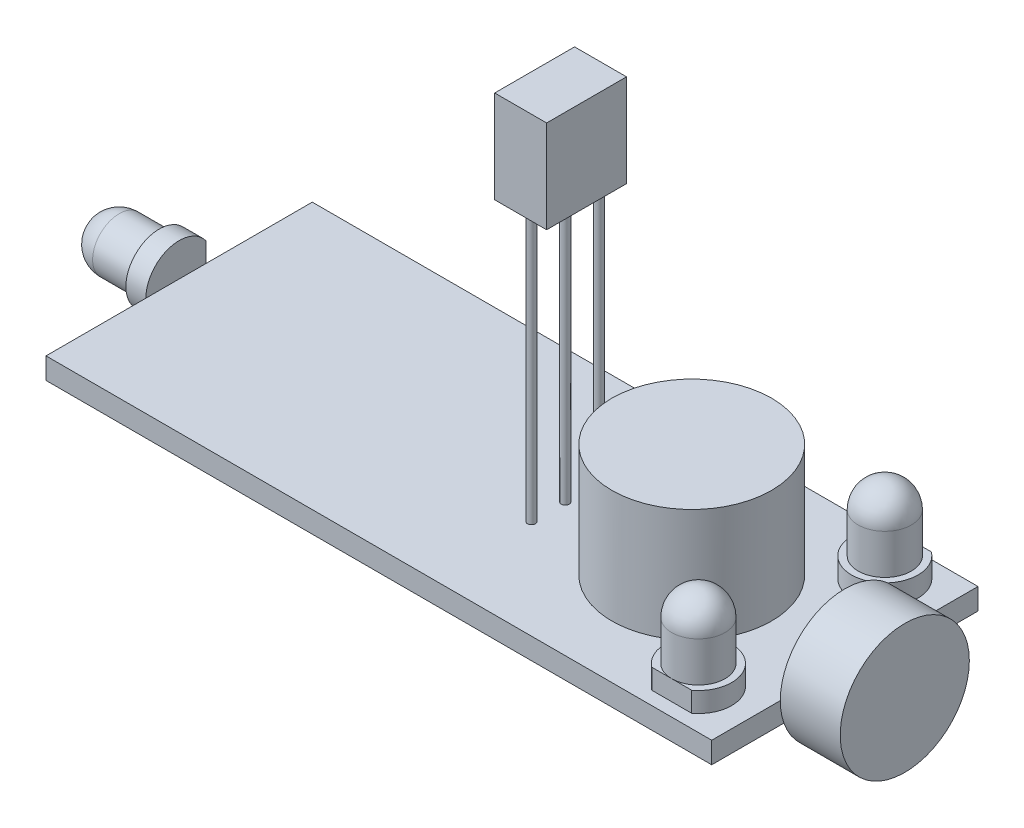
ISO-10303-21;
HEADER;
FILE_DESCRIPTION(('STEP AP214'),'2;1');
FILE_NAME('part.step','',(''),(''),'','','');
FILE_SCHEMA(('AUTOMOTIVE_DESIGN { 1 0 10303 214 1 1 1 1 }'));
ENDSEC;
DATA;
#1=APPLICATION_CONTEXT('core data for automotive mechanical design processes');
#2=APPLICATION_PROTOCOL_DEFINITION('international standard','automotive_design',2000,#1);
#3=PRODUCT_CONTEXT('',#1,'mechanical');
#4=PRODUCT('Part','Part','',(#3));
#5=PRODUCT_RELATED_PRODUCT_CATEGORY('part','',(#4));
#6=PRODUCT_DEFINITION_FORMATION('','',#4);
#7=PRODUCT_DEFINITION_CONTEXT('part definition',#1,'design');
#8=PRODUCT_DEFINITION('design','',#6,#7);
#9=PRODUCT_DEFINITION_SHAPE('','',#8);
#10=(LENGTH_UNIT() NAMED_UNIT(*) SI_UNIT(.MILLI.,.METRE.));
#11=(NAMED_UNIT(*) PLANE_ANGLE_UNIT() SI_UNIT($,.RADIAN.));
#12=(NAMED_UNIT(*) SI_UNIT($,.STERADIAN.) SOLID_ANGLE_UNIT());
#13=UNCERTAINTY_MEASURE_WITH_UNIT(LENGTH_MEASURE(1.E-05),#10,'distance_accuracy_value','');
#14=(GEOMETRIC_REPRESENTATION_CONTEXT(3) GLOBAL_UNCERTAINTY_ASSIGNED_CONTEXT((#13)) GLOBAL_UNIT_ASSIGNED_CONTEXT((#10,
#11,#12)) REPRESENTATION_CONTEXT('',''));
#15=CARTESIAN_POINT('',(0.,0.,0.));
#16=DIRECTION('',(0.,0.,1.));
#17=DIRECTION('',(1.,0.,0.));
#18=AXIS2_PLACEMENT_3D('',#15,#16,#17);
#19=CARTESIAN_POINT('',(0.,1.6,0.));
#20=DIRECTION('',(1.,0.,0.));
#21=DIRECTION('',(0.,0.,-1.));
#22=AXIS2_PLACEMENT_3D('',#19,#20,#21);
#23=PLANE('',#22);
#24=CARTESIAN_POINT('',(0.,1.6,-10.));
#25=DIRECTION('',(-1.,0.,0.));
#26=DIRECTION('',(0.,0.,1.));
#27=AXIS2_PLACEMENT_3D('',#24,#25,#26);
#28=CIRCLE('',#27,2.5);
#29=CARTESIAN_POINT('',(0.,0.,-8.07906272877015));
#30=VERTEX_POINT('',#29);
#31=CARTESIAN_POINT('',(0.,1.6,-7.5));
#32=VERTEX_POINT('',#31);
#33=EDGE_CURVE('E11',#30,#32,#28,.T.);
#34=ORIENTED_EDGE('',*,*,#33,.F.);
#35=DIRECTION('',(0.,0.,1.));
#36=VECTOR('',#35,1.);
#37=CARTESIAN_POINT('',(0.,0.,0.));
#38=LINE('',#37,#36);
#39=CARTESIAN_POINT('',(0.,0.,0.));
#40=VERTEX_POINT('',#39);
#41=EDGE_CURVE('E288',#30,#40,#38,.T.);
#42=ORIENTED_EDGE('',*,*,#41,.T.);
#43=DIRECTION('',(0.,-1.,0.));
#44=VECTOR('',#43,1.);
#45=CARTESIAN_POINT('',(0.,1.6,0.));
#46=LINE('',#45,#44);
#47=CARTESIAN_POINT('',(0.,1.6,0.));
#48=VERTEX_POINT('',#47);
#49=EDGE_CURVE('E323',#48,#40,#46,.T.);
#50=ORIENTED_EDGE('',*,*,#49,.F.);
#51=DIRECTION('',(0.,0.,1.));
#52=VECTOR('',#51,1.);
#53=CARTESIAN_POINT('',(0.,1.6,0.));
#54=LINE('',#53,#52);
#55=EDGE_CURVE('E55',#32,#48,#54,.T.);
#56=ORIENTED_EDGE('',*,*,#55,.F.);
#57=EDGE_LOOP('',(#34,#42,#50,#56));
#58=FACE_BOUND('',#57,.T.);
#59=ADVANCED_FACE('F37',(#58),#23,.F.);
#60=CARTESIAN_POINT('',(0.,0.100000000000001,-12.));
#61=VERTEX_POINT('',#60);
#62=CARTESIAN_POINT('',(0.,0.,-11.9209372712299));
#63=VERTEX_POINT('',#62);
#64=EDGE_CURVE('E47',#61,#63,#28,.T.);
#65=ORIENTED_EDGE('',*,*,#64,.F.);
#66=DIRECTION('',(0.,-1.,0.));
#67=VECTOR('',#66,1.);
#68=CARTESIAN_POINT('',(0.,0.,-12.));
#69=LINE('',#68,#67);
#70=CARTESIAN_POINT('',(0.,1.6,-12.));
#71=VERTEX_POINT('',#70);
#72=EDGE_CURVE('E45',#71,#61,#69,.T.);
#73=ORIENTED_EDGE('',*,*,#72,.F.);
#74=CARTESIAN_POINT('',(0.,1.6,-20.));
#75=VERTEX_POINT('',#74);
#76=EDGE_CURVE('E289',#75,#71,#54,.T.);
#77=ORIENTED_EDGE('',*,*,#76,.F.);
#78=DIRECTION('',(0.,-1.,0.));
#79=VECTOR('',#78,1.);
#80=CARTESIAN_POINT('',(0.,1.6,-20.));
#81=LINE('',#80,#79);
#82=CARTESIAN_POINT('',(0.,0.,-20.));
#83=VERTEX_POINT('',#82);
#84=EDGE_CURVE('E301',#75,#83,#81,.T.);
#85=ORIENTED_EDGE('',*,*,#84,.T.);
#86=EDGE_CURVE('E302',#83,#63,#38,.T.);
#87=ORIENTED_EDGE('',*,*,#86,.T.);
#88=EDGE_LOOP('',(#65,#73,#77,#85,#87));
#89=FACE_BOUND('',#88,.T.);
#90=ADVANCED_FACE('F413',(#89),#23,.F.);
#91=CARTESIAN_POINT('',(46.,3.1,-17.));
#92=DIRECTION('',(0.,-1.,0.));
#93=DIRECTION('',(0.,0.,-1.));
#94=AXIS2_PLACEMENT_3D('',#91,#92,#93);
#95=CYLINDRICAL_SURFACE('',#94,2.5);
#96=DIRECTION('',(0.,-1.,0.));
#97=VECTOR('',#96,1.);
#98=CARTESIAN_POINT('',(47.5,28.551,-19.));
#99=LINE('',#98,#97);
#100=CARTESIAN_POINT('',(47.5,3.1,-19.));
#101=VERTEX_POINT('',#100);
#102=CARTESIAN_POINT('',(47.5,1.6,-19.));
#103=VERTEX_POINT('',#102);
#104=EDGE_CURVE('E224',#101,#103,#99,.T.);
#105=ORIENTED_EDGE('',*,*,#104,.F.);
#106=CARTESIAN_POINT('',(46.,3.1,-17.));
#107=DIRECTION('',(0.,1.,0.));
#108=DIRECTION('',(0.,0.,1.));
#109=AXIS2_PLACEMENT_3D('',#106,#107,#108);
#110=CIRCLE('',#109,2.5);
#111=CARTESIAN_POINT('',(44.5,3.1,-19.));
#112=VERTEX_POINT('',#111);
#113=EDGE_CURVE('E235',#112,#101,#110,.T.);
#114=ORIENTED_EDGE('',*,*,#113,.F.);
#115=DIRECTION('',(0.,-1.,0.));
#116=VECTOR('',#115,1.);
#117=CARTESIAN_POINT('',(44.5,28.551,-19.));
#118=LINE('',#117,#116);
#119=CARTESIAN_POINT('',(44.5,1.6,-19.));
#120=VERTEX_POINT('',#119);
#121=EDGE_CURVE('E226',#112,#120,#118,.T.);
#122=ORIENTED_EDGE('',*,*,#121,.T.);
#123=CARTESIAN_POINT('',(46.,1.6,-17.));
#124=DIRECTION('',(0.,-1.,0.));
#125=DIRECTION('',(0.,0.,-1.));
#126=AXIS2_PLACEMENT_3D('',#123,#124,#125);
#127=CIRCLE('',#126,2.5);
#128=EDGE_CURVE('E341',#120,#103,#127,.F.);
#129=ORIENTED_EDGE('',*,*,#128,.T.);
#130=EDGE_LOOP('',(#105,#114,#122,#129));
#131=FACE_BOUND('',#130,.T.);
#132=ADVANCED_FACE('F417',(#131),#95,.T.);
#133=CARTESIAN_POINT('',(0.,3.1,0.));
#134=DIRECTION('',(0.,1.,0.));
#135=DIRECTION('',(0.,0.,1.));
#136=AXIS2_PLACEMENT_3D('',#133,#134,#135);
#137=PLANE('',#136);
#138=ORIENTED_EDGE('',*,*,#113,.T.);
#139=DIRECTION('',(1.,0.,0.));
#140=VECTOR('',#139,1.);
#141=CARTESIAN_POINT('',(44.5,3.1,-19.));
#142=LINE('',#141,#140);
#143=CARTESIAN_POINT('',(46.,3.1,-19.));
#144=VERTEX_POINT('',#143);
#145=EDGE_CURVE('E229',#144,#101,#142,.T.);
#146=ORIENTED_EDGE('',*,*,#145,.F.);
#147=CARTESIAN_POINT('',(46.,3.1,-17.));
#148=DIRECTION('',(0.,1.,0.));
#149=DIRECTION('',(0.,0.,1.));
#150=AXIS2_PLACEMENT_3D('',#147,#148,#149);
#151=CIRCLE('',#150,2.);
#152=EDGE_CURVE('E343',#144,#144,#151,.T.);
#153=ORIENTED_EDGE('',*,*,#152,.F.);
#154=EDGE_CURVE('E230',#112,#144,#142,.T.);
#155=ORIENTED_EDGE('',*,*,#154,.F.);
#156=EDGE_LOOP('',(#138,#146,#153,#155));
#157=FACE_BOUND('',#156,.T.);
#158=ADVANCED_FACE('F421',(#157),#137,.T.);
#159=CARTESIAN_POINT('',(0.,1.6,0.));
#160=DIRECTION('',(0.,-1.,0.));
#161=DIRECTION('',(0.,0.,-1.));
#162=AXIS2_PLACEMENT_3D('',#159,#160,#161);
#163=PLANE('',#162);
#164=CARTESIAN_POINT('',(46.,1.6,-3.));
#165=DIRECTION('',(0.,-1.,0.));
#166=DIRECTION('',(0.,0.,-1.));
#167=AXIS2_PLACEMENT_3D('',#164,#165,#166);
#168=CIRCLE('',#167,2.5);
#169=CARTESIAN_POINT('',(44.5,1.6,-0.999999999999997));
#170=VERTEX_POINT('',#169);
#171=CARTESIAN_POINT('',(47.5,1.6,-0.999999999999997));
#172=VERTEX_POINT('',#171);
#173=EDGE_CURVE('E215',#170,#172,#168,.T.);
#174=ORIENTED_EDGE('',*,*,#173,.T.);
#175=DIRECTION('',(1.,0.,0.));
#176=VECTOR('',#175,1.);
#177=CARTESIAN_POINT('',(44.5,1.6,-0.999999999999997));
#178=LINE('',#177,#176);
#179=EDGE_CURVE('E201',#170,#172,#178,.T.);
#180=ORIENTED_EDGE('',*,*,#179,.F.);
#181=EDGE_LOOP('',(#174,#180));
#182=FACE_BOUND('',#181,.T.);
#183=CARTESIAN_POINT('',(38.5,1.6,-10.));
#184=DIRECTION('',(0.,-1.,0.));
#185=DIRECTION('',(0.,0.,-1.));
#186=AXIS2_PLACEMENT_3D('',#183,#184,#185);
#187=CIRCLE('',#186,6.00000000000001);
#188=CARTESIAN_POINT('',(38.5,1.6,-16.));
#189=VERTEX_POINT('',#188);
#190=EDGE_CURVE('E338',#189,#189,#187,.F.);
#191=ORIENTED_EDGE('',*,*,#190,.F.);
#192=EDGE_LOOP('',(#191));
#193=FACE_BOUND('',#192,.T.);
#194=CARTESIAN_POINT('',(29.,1.6,-10.));
#195=DIRECTION('',(0.,-1.,0.));
#196=DIRECTION('',(0.,0.,-1.));
#197=AXIS2_PLACEMENT_3D('',#194,#195,#196);
#198=CIRCLE('',#197,0.300000000000004);
#199=CARTESIAN_POINT('',(29.,1.6,-10.3));
#200=VERTEX_POINT('',#199);
#201=EDGE_CURVE('E329',#200,#200,#198,.F.);
#202=ORIENTED_EDGE('',*,*,#201,.F.);
#203=EDGE_LOOP('',(#202));
#204=FACE_BOUND('',#203,.T.);
#205=ORIENTED_EDGE('',*,*,#76,.T.);
#206=EDGE_CURVE('E292',#71,#32,#54,.T.);
#207=ORIENTED_EDGE('',*,*,#206,.T.);
#208=ORIENTED_EDGE('',*,*,#55,.T.);
#209=DIRECTION('',(1.,0.,0.));
#210=VECTOR('',#209,1.);
#211=CARTESIAN_POINT('',(0.,1.6,0.));
#212=LINE('',#211,#210);
#213=CARTESIAN_POINT('',(50.,1.6,0.));
#214=VERTEX_POINT('',#213);
#215=EDGE_CURVE('E291',#48,#214,#212,.T.);
#216=ORIENTED_EDGE('',*,*,#215,.T.);
#217=DIRECTION('',(0.,0.,-1.));
#218=VECTOR('',#217,1.);
#219=CARTESIAN_POINT('',(50.,1.6,0.));
#220=LINE('',#219,#218);
#221=CARTESIAN_POINT('',(50.,1.6,-5.15));
#222=VERTEX_POINT('',#221);
#223=EDGE_CURVE('E295',#214,#222,#220,.T.);
#224=ORIENTED_EDGE('',*,*,#223,.T.);
#225=CARTESIAN_POINT('',(50.,1.6,-14.85));
#226=VERTEX_POINT('',#225);
#227=EDGE_CURVE('E299',#222,#226,#220,.T.);
#228=ORIENTED_EDGE('',*,*,#227,.T.);
#229=CARTESIAN_POINT('',(50.,1.6,-20.));
#230=VERTEX_POINT('',#229);
#231=EDGE_CURVE('E294',#226,#230,#220,.T.);
#232=ORIENTED_EDGE('',*,*,#231,.T.);
#233=DIRECTION('',(-1.,0.,0.));
#234=VECTOR('',#233,1.);
#235=CARTESIAN_POINT('',(0.,1.6,-20.));
#236=LINE('',#235,#234);
#237=EDGE_CURVE('E298',#230,#75,#236,.T.);
#238=ORIENTED_EDGE('',*,*,#237,.T.);
#239=EDGE_LOOP('',(#205,#207,#208,#216,#224,#228,#232,#238));
#240=FACE_BOUND('',#239,.T.);
#241=CARTESIAN_POINT('',(29.,1.6,-12.54));
#242=DIRECTION('',(0.,-1.,0.));
#243=DIRECTION('',(0.,0.,-1.));
#244=AXIS2_PLACEMENT_3D('',#241,#242,#243);
#245=CIRCLE('',#244,0.300000000000004);
#246=CARTESIAN_POINT('',(29.,1.6,-12.84));
#247=VERTEX_POINT('',#246);
#248=EDGE_CURVE('E326',#247,#247,#245,.F.);
#249=ORIENTED_EDGE('',*,*,#248,.F.);
#250=EDGE_LOOP('',(#249));
#251=FACE_BOUND('',#250,.T.);
#252=CARTESIAN_POINT('',(29.,1.6,-7.46));
#253=DIRECTION('',(0.,-1.,0.));
#254=DIRECTION('',(0.,0.,-1.));
#255=AXIS2_PLACEMENT_3D('',#252,#253,#254);
#256=CIRCLE('',#255,0.300000000000004);
#257=CARTESIAN_POINT('',(29.,1.6,-7.76));
#258=VERTEX_POINT('',#257);
#259=EDGE_CURVE('E332',#258,#258,#256,.F.);
#260=ORIENTED_EDGE('',*,*,#259,.F.);
#261=EDGE_LOOP('',(#260));
#262=FACE_BOUND('',#261,.T.);
#263=ORIENTED_EDGE('',*,*,#128,.F.);
#264=DIRECTION('',(1.,0.,0.));
#265=VECTOR('',#264,1.);
#266=CARTESIAN_POINT('',(44.5,1.6,-19.));
#267=LINE('',#266,#265);
#268=EDGE_CURVE('E219',#120,#103,#267,.T.);
#269=ORIENTED_EDGE('',*,*,#268,.T.);
#270=EDGE_LOOP('',(#263,#269));
#271=FACE_BOUND('',#270,.T.);
#272=ADVANCED_FACE('F362',(#182,#193,#204,#240,#251,#262,#271),#163,.F.);
#273=CARTESIAN_POINT('',(50.,1.6,0.));
#274=DIRECTION('',(-1.,0.,0.));
#275=DIRECTION('',(0.,0.,1.));
#276=AXIS2_PLACEMENT_3D('',#273,#274,#275);
#277=PLANE('',#276);
#278=CARTESIAN_POINT('',(50.,1.6,-10.));
#279=DIRECTION('',(1.,0.,0.));
#280=DIRECTION('',(0.,0.,-1.));
#281=AXIS2_PLACEMENT_3D('',#278,#279,#280);
#282=CIRCLE('',#281,4.85);
#283=CARTESIAN_POINT('',(50.,0.,-5.42151771871944));
#284=VERTEX_POINT('',#283);
#285=EDGE_CURVE('E344',#222,#284,#282,.T.);
#286=ORIENTED_EDGE('',*,*,#285,.F.);
#287=ORIENTED_EDGE('',*,*,#223,.F.);
#288=DIRECTION('',(0.,-1.,0.));
#289=VECTOR('',#288,1.);
#290=CARTESIAN_POINT('',(50.,1.6,0.));
#291=LINE('',#290,#289);
#292=CARTESIAN_POINT('',(50.,0.,0.));
#293=VERTEX_POINT('',#292);
#294=EDGE_CURVE('E320',#214,#293,#291,.T.);
#295=ORIENTED_EDGE('',*,*,#294,.T.);
#296=DIRECTION('',(0.,0.,-1.));
#297=VECTOR('',#296,1.);
#298=CARTESIAN_POINT('',(50.,0.,0.));
#299=LINE('',#298,#297);
#300=EDGE_CURVE('E309',#293,#284,#299,.T.);
#301=ORIENTED_EDGE('',*,*,#300,.T.);
#302=EDGE_LOOP('',(#286,#287,#295,#301));
#303=FACE_BOUND('',#302,.T.);
#304=ADVANCED_FACE('F376',(#303),#277,.F.);
#305=CARTESIAN_POINT('',(50.,0.,-14.5784822812806));
#306=VERTEX_POINT('',#305);
#307=EDGE_CURVE('E246',#306,#226,#282,.T.);
#308=ORIENTED_EDGE('',*,*,#307,.F.);
#309=CARTESIAN_POINT('',(50.,0.,-20.));
#310=VERTEX_POINT('',#309);
#311=EDGE_CURVE('E308',#306,#310,#299,.T.);
#312=ORIENTED_EDGE('',*,*,#311,.T.);
#313=DIRECTION('',(0.,-1.,0.));
#314=VECTOR('',#313,1.);
#315=CARTESIAN_POINT('',(50.,1.6,-20.));
#316=LINE('',#315,#314);
#317=EDGE_CURVE('E317',#230,#310,#316,.T.);
#318=ORIENTED_EDGE('',*,*,#317,.F.);
#319=ORIENTED_EDGE('',*,*,#231,.F.);
#320=EDGE_LOOP('',(#308,#312,#318,#319));
#321=FACE_BOUND('',#320,.T.);
#322=ADVANCED_FACE('F390',(#321),#277,.F.);
#323=CARTESIAN_POINT('',(26.7,28.55,-13.));
#324=DIRECTION('',(1.,0.,0.));
#325=DIRECTION('',(0.,0.,-1.));
#326=AXIS2_PLACEMENT_3D('',#323,#324,#325);
#327=PLANE('',#326);
#328=DIRECTION('',(0.,0.,1.));
#329=VECTOR('',#328,1.);
#330=CARTESIAN_POINT('',(26.7,21.6,-13.));
#331=LINE('',#330,#329);
#332=CARTESIAN_POINT('',(26.7,21.6,-13.));
#333=VERTEX_POINT('',#332);
#334=CARTESIAN_POINT('',(26.7,21.6,-7.));
#335=VERTEX_POINT('',#334);
#336=EDGE_CURVE('E249',#333,#335,#331,.T.);
#337=ORIENTED_EDGE('',*,*,#336,.T.);
#338=DIRECTION('',(0.,-1.,0.));
#339=VECTOR('',#338,1.);
#340=CARTESIAN_POINT('',(26.7,28.55,-7.));
#341=LINE('',#340,#339);
#342=CARTESIAN_POINT('',(26.7,28.55,-7.));
#343=VERTEX_POINT('',#342);
#344=EDGE_CURVE('E276',#343,#335,#341,.T.);
#345=ORIENTED_EDGE('',*,*,#344,.F.);
#346=DIRECTION('',(0.,0.,1.));
#347=VECTOR('',#346,1.);
#348=CARTESIAN_POINT('',(26.7,28.55,-13.));
#349=LINE('',#348,#347);
#350=CARTESIAN_POINT('',(26.7,28.55,-13.));
#351=VERTEX_POINT('',#350);
#352=EDGE_CURVE('E250',#351,#343,#349,.T.);
#353=ORIENTED_EDGE('',*,*,#352,.F.);
#354=DIRECTION('',(0.,-1.,0.));
#355=VECTOR('',#354,1.);
#356=CARTESIAN_POINT('',(26.7,28.55,-13.));
#357=LINE('',#356,#355);
#358=EDGE_CURVE('E260',#351,#333,#357,.T.);
#359=ORIENTED_EDGE('',*,*,#358,.T.);
#360=EDGE_LOOP('',(#337,#345,#353,#359));
#361=FACE_BOUND('',#360,.T.);
#362=CARTESIAN_POINT('',(26.7,25.85,-10.));
#363=DIRECTION('',(1.,0.,0.));
#364=DIRECTION('',(0.,0.,-1.));
#365=AXIS2_PLACEMENT_3D('',#362,#363,#364);
#366=CIRCLE('',#365,2.5);
#367=CARTESIAN_POINT('',(26.7,25.85,-12.5));
#368=VERTEX_POINT('',#367);
#369=EDGE_CURVE('E335',#368,#368,#366,.F.);
#370=ORIENTED_EDGE('',*,*,#369,.F.);
#371=EDGE_LOOP('',(#370));
#372=FACE_BOUND('',#371,.T.);
#373=ADVANCED_FACE('F667',(#361,#372),#327,.F.);
#374=CARTESIAN_POINT('',(0.,1.6,0.));
#375=DIRECTION('',(0.,0.,-1.));
#376=DIRECTION('',(-1.,0.,0.));
#377=AXIS2_PLACEMENT_3D('',#374,#375,#376);
#378=PLANE('',#377);
#379=DIRECTION('',(1.,0.,0.));
#380=VECTOR('',#379,1.);
#381=CARTESIAN_POINT('',(0.,0.,0.));
#382=LINE('',#381,#380);
#383=EDGE_CURVE('E305',#40,#293,#382,.T.);
#384=ORIENTED_EDGE('',*,*,#383,.T.);
#385=ORIENTED_EDGE('',*,*,#294,.F.);
#386=ORIENTED_EDGE('',*,*,#215,.F.);
#387=ORIENTED_EDGE('',*,*,#49,.T.);
#388=EDGE_LOOP('',(#384,#385,#386,#387));
#389=FACE_BOUND('',#388,.T.);
#390=ADVANCED_FACE('F366',(#389),#378,.F.);
#391=CARTESIAN_POINT('',(0.,1.6,-20.));
#392=DIRECTION('',(0.,0.,1.));
#393=DIRECTION('',(1.,0.,0.));
#394=AXIS2_PLACEMENT_3D('',#391,#392,#393);
#395=PLANE('',#394);
#396=DIRECTION('',(-1.,0.,0.));
#397=VECTOR('',#396,1.);
#398=CARTESIAN_POINT('',(0.,0.,-20.));
#399=LINE('',#398,#397);
#400=EDGE_CURVE('E312',#310,#83,#399,.T.);
#401=ORIENTED_EDGE('',*,*,#400,.T.);
#402=ORIENTED_EDGE('',*,*,#84,.F.);
#403=ORIENTED_EDGE('',*,*,#237,.F.);
#404=ORIENTED_EDGE('',*,*,#317,.T.);
#405=EDGE_LOOP('',(#401,#402,#403,#404));
#406=FACE_BOUND('',#405,.T.);
#407=ADVANCED_FACE('F505',(#406),#395,.F.);
#408=CARTESIAN_POINT('',(0.,0.,0.));
#409=DIRECTION('',(0.,-1.,0.));
#410=DIRECTION('',(0.,0.,-1.));
#411=AXIS2_PLACEMENT_3D('',#408,#409,#410);
#412=PLANE('',#411);
#413=ORIENTED_EDGE('',*,*,#86,.F.);
#414=ORIENTED_EDGE('',*,*,#400,.F.);
#415=ORIENTED_EDGE('',*,*,#311,.F.);
#416=EDGE_CURVE('E313',#284,#306,#299,.T.);
#417=ORIENTED_EDGE('',*,*,#416,.F.);
#418=ORIENTED_EDGE('',*,*,#300,.F.);
#419=ORIENTED_EDGE('',*,*,#383,.F.);
#420=ORIENTED_EDGE('',*,*,#41,.F.);
#421=EDGE_CURVE('E306',#63,#30,#38,.T.);
#422=ORIENTED_EDGE('',*,*,#421,.F.);
#423=EDGE_LOOP('',(#413,#414,#415,#417,#418,#419,#420,#422));
#424=FACE_BOUND('',#423,.T.);
#425=ADVANCED_FACE('F374',(#424),#412,.T.);
#426=CARTESIAN_POINT('',(29.,21.6,-12.54));
#427=DIRECTION('',(0.,-1.,0.));
#428=DIRECTION('',(0.,0.,-1.));
#429=AXIS2_PLACEMENT_3D('',#426,#427,#428);
#430=CYLINDRICAL_SURFACE('',#429,0.300000000000004);
#431=CARTESIAN_POINT('',(29.,21.6,-12.54));
#432=DIRECTION('',(0.,1.,0.));
#433=DIRECTION('',(0.,0.,1.));
#434=AXIS2_PLACEMENT_3D('',#431,#432,#433);
#435=CIRCLE('',#434,0.300000000000004);
#436=CARTESIAN_POINT('',(29.,21.6,-12.24));
#437=VERTEX_POINT('',#436);
#438=EDGE_CURVE('E285',#437,#437,#435,.T.);
#439=ORIENTED_EDGE('',*,*,#438,.F.);
#440=EDGE_LOOP('',(#439));
#441=FACE_BOUND('',#440,.T.);
#442=ORIENTED_EDGE('',*,*,#248,.T.);
#443=EDGE_LOOP('',(#442));
#444=FACE_BOUND('',#443,.T.);
#445=ADVANCED_FACE('F504',(#441,#444),#430,.T.);
#446=CARTESIAN_POINT('',(29.,21.6,-10.));
#447=DIRECTION('',(0.,-1.,0.));
#448=DIRECTION('',(0.,0.,-1.));
#449=AXIS2_PLACEMENT_3D('',#446,#447,#448);
#450=CYLINDRICAL_SURFACE('',#449,0.300000000000004);
#451=CARTESIAN_POINT('',(29.,21.6,-10.));
#452=DIRECTION('',(0.,1.,0.));
#453=DIRECTION('',(0.,0.,1.));
#454=AXIS2_PLACEMENT_3D('',#451,#452,#453);
#455=CIRCLE('',#454,0.300000000000004);
#456=CARTESIAN_POINT('',(29.,21.6,-9.7));
#457=VERTEX_POINT('',#456);
#458=EDGE_CURVE('E282',#457,#457,#455,.T.);
#459=ORIENTED_EDGE('',*,*,#458,.F.);
#460=EDGE_LOOP('',(#459));
#461=FACE_BOUND('',#460,.T.);
#462=ORIENTED_EDGE('',*,*,#201,.T.);
#463=EDGE_LOOP('',(#462));
#464=FACE_BOUND('',#463,.T.);
#465=ADVANCED_FACE('F768',(#461,#464),#450,.T.);
#466=CARTESIAN_POINT('',(29.,21.6,-7.46));
#467=DIRECTION('',(0.,-1.,0.));
#468=DIRECTION('',(0.,0.,-1.));
#469=AXIS2_PLACEMENT_3D('',#466,#467,#468);
#470=CYLINDRICAL_SURFACE('',#469,0.300000000000004);
#471=CARTESIAN_POINT('',(29.,21.6,-7.46));
#472=DIRECTION('',(0.,1.,0.));
#473=DIRECTION('',(0.,0.,1.));
#474=AXIS2_PLACEMENT_3D('',#471,#472,#473);
#475=CIRCLE('',#474,0.300000000000004);
#476=CARTESIAN_POINT('',(29.,21.6,-7.16));
#477=VERTEX_POINT('',#476);
#478=EDGE_CURVE('E279',#477,#477,#475,.T.);
#479=ORIENTED_EDGE('',*,*,#478,.F.);
#480=EDGE_LOOP('',(#479));
#481=FACE_BOUND('',#480,.T.);
#482=ORIENTED_EDGE('',*,*,#259,.T.);
#483=EDGE_LOOP('',(#482));
#484=FACE_BOUND('',#483,.T.);
#485=ADVANCED_FACE('F758',(#481,#484),#470,.T.);
#486=CARTESIAN_POINT('',(0.,21.6,0.));
#487=DIRECTION('',(0.,1.,0.));
#488=DIRECTION('',(0.,0.,1.));
#489=AXIS2_PLACEMENT_3D('',#486,#487,#488);
#490=PLANE('',#489);
#491=ORIENTED_EDGE('',*,*,#458,.T.);
#492=EDGE_LOOP('',(#491));
#493=FACE_BOUND('',#492,.T.);
#494=ORIENTED_EDGE('',*,*,#336,.F.);
#495=DIRECTION('',(-1.,0.,0.));
#496=VECTOR('',#495,1.);
#497=CARTESIAN_POINT('',(26.7,21.6,-13.));
#498=LINE('',#497,#496);
#499=CARTESIAN_POINT('',(30.6,21.6,-13.));
#500=VERTEX_POINT('',#499);
#501=EDGE_CURVE('E254',#500,#333,#498,.T.);
#502=ORIENTED_EDGE('',*,*,#501,.F.);
#503=DIRECTION('',(0.,0.,-1.));
#504=VECTOR('',#503,1.);
#505=CARTESIAN_POINT('',(30.6,21.6,-13.));
#506=LINE('',#505,#504);
#507=CARTESIAN_POINT('',(30.6,21.6,-7.));
#508=VERTEX_POINT('',#507);
#509=EDGE_CURVE('E265',#508,#500,#506,.T.);
#510=ORIENTED_EDGE('',*,*,#509,.F.);
#511=DIRECTION('',(1.,0.,0.));
#512=VECTOR('',#511,1.);
#513=CARTESIAN_POINT('',(26.7,21.6,-7.));
#514=LINE('',#513,#512);
#515=EDGE_CURVE('E263',#335,#508,#514,.T.);
#516=ORIENTED_EDGE('',*,*,#515,.F.);
#517=EDGE_LOOP('',(#494,#502,#510,#516));
#518=FACE_BOUND('',#517,.T.);
#519=ORIENTED_EDGE('',*,*,#478,.T.);
#520=EDGE_LOOP('',(#519));
#521=FACE_BOUND('',#520,.T.);
#522=ORIENTED_EDGE('',*,*,#438,.T.);
#523=EDGE_LOOP('',(#522));
#524=FACE_BOUND('',#523,.T.);
#525=ADVANCED_FACE('F748',(#493,#518,#521,#524),#490,.F.);
#526=CARTESIAN_POINT('',(26.7,28.55,-7.));
#527=DIRECTION('',(0.,0.,-1.));
#528=DIRECTION('',(-1.,0.,0.));
#529=AXIS2_PLACEMENT_3D('',#526,#527,#528);
#530=PLANE('',#529);
#531=ORIENTED_EDGE('',*,*,#515,.T.);
#532=DIRECTION('',(0.,-1.,0.));
#533=VECTOR('',#532,1.);
#534=CARTESIAN_POINT('',(30.6,28.55,-7.));
#535=LINE('',#534,#533);
#536=CARTESIAN_POINT('',(30.6,28.55,-7.));
#537=VERTEX_POINT('',#536);
#538=EDGE_CURVE('E273',#537,#508,#535,.T.);
#539=ORIENTED_EDGE('',*,*,#538,.F.);
#540=DIRECTION('',(1.,0.,0.));
#541=VECTOR('',#540,1.);
#542=CARTESIAN_POINT('',(26.7,28.55,-7.));
#543=LINE('',#542,#541);
#544=EDGE_CURVE('E253',#343,#537,#543,.T.);
#545=ORIENTED_EDGE('',*,*,#544,.F.);
#546=ORIENTED_EDGE('',*,*,#344,.T.);
#547=EDGE_LOOP('',(#531,#539,#545,#546));
#548=FACE_BOUND('',#547,.T.);
#549=ADVANCED_FACE('F738',(#548),#530,.F.);
#550=CARTESIAN_POINT('',(30.6,28.55,-13.));
#551=DIRECTION('',(-1.,0.,0.));
#552=DIRECTION('',(0.,0.,1.));
#553=AXIS2_PLACEMENT_3D('',#550,#551,#552);
#554=PLANE('',#553);
#555=ORIENTED_EDGE('',*,*,#509,.T.);
#556=DIRECTION('',(0.,-1.,0.));
#557=VECTOR('',#556,1.);
#558=CARTESIAN_POINT('',(30.6,28.55,-13.));
#559=LINE('',#558,#557);
#560=CARTESIAN_POINT('',(30.6,28.55,-13.));
#561=VERTEX_POINT('',#560);
#562=EDGE_CURVE('E270',#561,#500,#559,.T.);
#563=ORIENTED_EDGE('',*,*,#562,.F.);
#564=DIRECTION('',(0.,0.,-1.));
#565=VECTOR('',#564,1.);
#566=CARTESIAN_POINT('',(30.6,28.55,-13.));
#567=LINE('',#566,#565);
#568=EDGE_CURVE('E256',#537,#561,#567,.T.);
#569=ORIENTED_EDGE('',*,*,#568,.F.);
#570=ORIENTED_EDGE('',*,*,#538,.T.);
#571=EDGE_LOOP('',(#555,#563,#569,#570));
#572=FACE_BOUND('',#571,.T.);
#573=ADVANCED_FACE('F728',(#572),#554,.F.);
#574=CARTESIAN_POINT('',(26.7,28.55,-13.));
#575=DIRECTION('',(0.,0.,1.));
#576=DIRECTION('',(1.,0.,0.));
#577=AXIS2_PLACEMENT_3D('',#574,#575,#576);
#578=PLANE('',#577);
#579=ORIENTED_EDGE('',*,*,#501,.T.);
#580=ORIENTED_EDGE('',*,*,#358,.F.);
#581=DIRECTION('',(-1.,0.,0.));
#582=VECTOR('',#581,1.);
#583=CARTESIAN_POINT('',(26.7,28.55,-13.));
#584=LINE('',#583,#582);
#585=EDGE_CURVE('E258',#561,#351,#584,.T.);
#586=ORIENTED_EDGE('',*,*,#585,.F.);
#587=ORIENTED_EDGE('',*,*,#562,.T.);
#588=EDGE_LOOP('',(#579,#580,#586,#587));
#589=FACE_BOUND('',#588,.T.);
#590=ADVANCED_FACE('F718',(#589),#578,.F.);
#591=CARTESIAN_POINT('',(0.,28.55,0.));
#592=DIRECTION('',(0.,1.,0.));
#593=DIRECTION('',(0.,0.,1.));
#594=AXIS2_PLACEMENT_3D('',#591,#592,#593);
#595=PLANE('',#594);
#596=ORIENTED_EDGE('',*,*,#352,.T.);
#597=ORIENTED_EDGE('',*,*,#544,.T.);
#598=ORIENTED_EDGE('',*,*,#568,.T.);
#599=ORIENTED_EDGE('',*,*,#585,.T.);
#600=EDGE_LOOP('',(#596,#597,#598,#599));
#601=FACE_BOUND('',#600,.T.);
#602=ADVANCED_FACE('F699',(#601),#595,.T.);
#603=CARTESIAN_POINT('',(28.6,25.85,-10.));
#604=DIRECTION('',(-1.,0.,0.));
#605=DIRECTION('',(0.,0.,-1.));
#606=AXIS2_PLACEMENT_3D('',#603,#604,#605);
#607=SPHERICAL_SURFACE('',#606,3.14006369362152);
#608=ORIENTED_EDGE('',*,*,#369,.T.);
#609=EDGE_LOOP('',(#608));
#610=FACE_BOUND('',#609,.T.);
#611=ADVANCED_FACE('F689',(#610),#607,.T.);
#612=CARTESIAN_POINT('',(38.5,10.1,-10.));
#613=DIRECTION('',(0.,-1.,0.));
#614=DIRECTION('',(0.,0.,-1.));
#615=AXIS2_PLACEMENT_3D('',#612,#613,#614);
#616=CYLINDRICAL_SURFACE('',#615,6.00000000000001);
#617=CARTESIAN_POINT('',(38.5,10.1,-10.));
#618=DIRECTION('',(0.,1.,0.));
#619=DIRECTION('',(0.,0.,1.));
#620=AXIS2_PLACEMENT_3D('',#617,#618,#619);
#621=CIRCLE('',#620,6.00000000000001);
#622=CARTESIAN_POINT('',(38.5,10.1,-3.99999999999999));
#623=VERTEX_POINT('',#622);
#624=EDGE_CURVE('E242',#623,#623,#621,.T.);
#625=ORIENTED_EDGE('',*,*,#624,.F.);
#626=EDGE_LOOP('',(#625));
#627=FACE_BOUND('',#626,.T.);
#628=ORIENTED_EDGE('',*,*,#190,.T.);
#629=EDGE_LOOP('',(#628));
#630=FACE_BOUND('',#629,.T.);
#631=ADVANCED_FACE('F406',(#627,#630),#616,.T.);
#632=CARTESIAN_POINT('',(38.5,10.1,-10.));
#633=DIRECTION('',(0.,1.,0.));
#634=DIRECTION('',(0.,0.,1.));
#635=AXIS2_PLACEMENT_3D('',#632,#633,#634);
#636=PLANE('',#635);
#637=ORIENTED_EDGE('',*,*,#624,.T.);
#638=EDGE_LOOP('',(#637));
#639=FACE_BOUND('',#638,.T.);
#640=ADVANCED_FACE('F397',(#639),#636,.T.);
#641=CARTESIAN_POINT('',(50.,1.6,-10.));
#642=DIRECTION('',(1.,0.,0.));
#643=DIRECTION('',(0.,0.,-1.));
#644=AXIS2_PLACEMENT_3D('',#641,#642,#643);
#645=PLANE('',#644);
#646=EDGE_CURVE('E238',#284,#306,#282,.T.);
#647=ORIENTED_EDGE('',*,*,#646,.F.);
#648=ORIENTED_EDGE('',*,*,#416,.T.);
#649=EDGE_LOOP('',(#647,#648));
#650=FACE_BOUND('',#649,.T.);
#651=ADVANCED_FACE('F395',(#650),#645,.F.);
#652=CARTESIAN_POINT('',(54.5,1.6,-10.));
#653=DIRECTION('',(-1.,0.,0.));
#654=DIRECTION('',(0.,0.,1.));
#655=AXIS2_PLACEMENT_3D('',#652,#653,#654);
#656=CYLINDRICAL_SURFACE('',#655,4.85);
#657=CARTESIAN_POINT('',(54.5,1.6,-10.));
#658=DIRECTION('',(1.,0.,0.));
#659=DIRECTION('',(0.,0.,-1.));
#660=AXIS2_PLACEMENT_3D('',#657,#658,#659);
#661=CIRCLE('',#660,4.85);
#662=CARTESIAN_POINT('',(54.5,1.6,-14.85));
#663=VERTEX_POINT('',#662);
#664=EDGE_CURVE('E239',#663,#663,#661,.T.);
#665=ORIENTED_EDGE('',*,*,#664,.F.);
#666=EDGE_LOOP('',(#665));
#667=FACE_BOUND('',#666,.T.);
#668=EDGE_CURVE('E243',#226,#222,#282,.T.);
#669=ORIENTED_EDGE('',*,*,#668,.T.);
#670=ORIENTED_EDGE('',*,*,#285,.T.);
#671=ORIENTED_EDGE('',*,*,#646,.T.);
#672=ORIENTED_EDGE('',*,*,#307,.T.);
#673=EDGE_LOOP('',(#669,#670,#671,#672));
#674=FACE_BOUND('',#673,.T.);
#675=ADVANCED_FACE('F386',(#667,#674),#656,.T.);
#676=CARTESIAN_POINT('',(54.5,1.6,-10.));
#677=DIRECTION('',(1.,0.,0.));
#678=DIRECTION('',(0.,0.,-1.));
#679=AXIS2_PLACEMENT_3D('',#676,#677,#678);
#680=PLANE('',#679);
#681=ORIENTED_EDGE('',*,*,#664,.T.);
#682=EDGE_LOOP('',(#681));
#683=FACE_BOUND('',#682,.T.);
#684=ADVANCED_FACE('F403',(#683),#680,.T.);
#685=ORIENTED_EDGE('',*,*,#227,.F.);
#686=ORIENTED_EDGE('',*,*,#668,.F.);
#687=EDGE_LOOP('',(#685,#686));
#688=FACE_BOUND('',#687,.T.);
#689=ADVANCED_FACE('F383',(#688),#645,.F.);
#690=CARTESIAN_POINT('',(46.,3.1,-17.));
#691=DIRECTION('',(0.,-1.,0.));
#692=DIRECTION('',(0.,0.,-1.));
#693=AXIS2_PLACEMENT_3D('',#690,#691,#692);
#694=CYLINDRICAL_SURFACE('',#693,2.);
#695=CARTESIAN_POINT('',(46.,6.1,-17.));
#696=DIRECTION('',(0.,-1.,0.));
#697=DIRECTION('',(0.,0.,-1.));
#698=AXIS2_PLACEMENT_3D('',#695,#696,#697);
#699=CIRCLE('',#698,2.);
#700=CARTESIAN_POINT('',(46.,6.1,-19.));
#701=VERTEX_POINT('',#700);
#702=EDGE_CURVE('E232',#701,#701,#699,.T.);
#703=ORIENTED_EDGE('',*,*,#702,.T.);
#704=EDGE_LOOP('',(#703));
#705=FACE_BOUND('',#704,.T.);
#706=ORIENTED_EDGE('',*,*,#152,.T.);
#707=EDGE_LOOP('',(#706));
#708=FACE_BOUND('',#707,.T.);
#709=ADVANCED_FACE('F411',(#705,#708),#694,.T.);
#710=CARTESIAN_POINT('',(46.,6.1,-17.));
#711=DIRECTION('',(0.,-1.,0.));
#712=DIRECTION('',(0.,0.,-1.));
#713=AXIS2_PLACEMENT_3D('',#710,#711,#712);
#714=SPHERICAL_SURFACE('',#713,2.);
#715=ORIENTED_EDGE('',*,*,#702,.F.);
#716=EDGE_LOOP('',(#715));
#717=FACE_BOUND('',#716,.T.);
#718=ADVANCED_FACE('F591',(#717),#714,.T.);
#719=CARTESIAN_POINT('',(44.5,28.551,-19.));
#720=DIRECTION('',(0.,0.,-1.));
#721=DIRECTION('',(-1.,0.,0.));
#722=AXIS2_PLACEMENT_3D('',#719,#720,#721);
#723=PLANE('',#722);
#724=ORIENTED_EDGE('',*,*,#154,.T.);
#725=ORIENTED_EDGE('',*,*,#145,.T.);
#726=ORIENTED_EDGE('',*,*,#104,.T.);
#727=ORIENTED_EDGE('',*,*,#268,.F.);
#728=ORIENTED_EDGE('',*,*,#121,.F.);
#729=EDGE_LOOP('',(#724,#725,#726,#727,#728));
#730=FACE_BOUND('',#729,.T.);
#731=ADVANCED_FACE('F581',(#730),#723,.T.);
#732=CARTESIAN_POINT('',(46.,3.1,-3.));
#733=DIRECTION('',(0.,-1.,0.));
#734=DIRECTION('',(0.,0.,-1.));
#735=AXIS2_PLACEMENT_3D('',#732,#733,#734);
#736=CYLINDRICAL_SURFACE('',#735,2.5);
#737=DIRECTION('',(0.,-1.,0.));
#738=VECTOR('',#737,1.);
#739=CARTESIAN_POINT('',(47.5,28.551,-0.999999999999997));
#740=LINE('',#739,#738);
#741=CARTESIAN_POINT('',(47.5,3.1,-0.999999999999997));
#742=VERTEX_POINT('',#741);
#743=EDGE_CURVE('E205',#742,#172,#740,.T.);
#744=ORIENTED_EDGE('',*,*,#743,.T.);
#745=ORIENTED_EDGE('',*,*,#173,.F.);
#746=DIRECTION('',(0.,-1.,0.));
#747=VECTOR('',#746,1.);
#748=CARTESIAN_POINT('',(44.5,28.551,-0.999999999999997));
#749=LINE('',#748,#747);
#750=CARTESIAN_POINT('',(44.5,3.1,-0.999999999999997));
#751=VERTEX_POINT('',#750);
#752=EDGE_CURVE('E203',#751,#170,#749,.T.);
#753=ORIENTED_EDGE('',*,*,#752,.F.);
#754=CARTESIAN_POINT('',(46.,3.1,-3.));
#755=DIRECTION('',(0.,-1.,0.));
#756=DIRECTION('',(0.,0.,-1.));
#757=AXIS2_PLACEMENT_3D('',#754,#755,#756);
#758=CIRCLE('',#757,2.5);
#759=EDGE_CURVE('E216',#751,#742,#758,.T.);
#760=ORIENTED_EDGE('',*,*,#759,.T.);
#761=EDGE_LOOP('',(#744,#745,#753,#760));
#762=FACE_BOUND('',#761,.T.);
#763=ADVANCED_FACE('F570',(#762),#736,.T.);
#764=CARTESIAN_POINT('',(0.,3.1,-20.));
#765=DIRECTION('',(0.,1.,0.));
#766=DIRECTION('',(0.,0.,-1.));
#767=AXIS2_PLACEMENT_3D('',#764,#765,#766);
#768=PLANE('',#767);
#769=DIRECTION('',(1.,0.,0.));
#770=VECTOR('',#769,1.);
#771=CARTESIAN_POINT('',(44.5,3.1,-0.999999999999997));
#772=LINE('',#771,#770);
#773=CARTESIAN_POINT('',(46.,3.1,-0.999999999999999));
#774=VERTEX_POINT('',#773);
#775=EDGE_CURVE('E208',#774,#742,#772,.T.);
#776=ORIENTED_EDGE('',*,*,#775,.T.);
#777=ORIENTED_EDGE('',*,*,#759,.F.);
#778=EDGE_CURVE('E211',#751,#774,#772,.T.);
#779=ORIENTED_EDGE('',*,*,#778,.T.);
#780=CARTESIAN_POINT('',(46.,3.1,-3.));
#781=DIRECTION('',(0.,1.,0.));
#782=DIRECTION('',(0.,0.,1.));
#783=AXIS2_PLACEMENT_3D('',#780,#781,#782);
#784=CIRCLE('',#783,2.);
#785=EDGE_CURVE('E40',#774,#774,#784,.T.);
#786=ORIENTED_EDGE('',*,*,#785,.F.);
#787=EDGE_LOOP('',(#776,#777,#779,#786));
#788=FACE_BOUND('',#787,.T.);
#789=ADVANCED_FACE('F558',(#788),#768,.T.);
#790=CARTESIAN_POINT('',(46.,3.1,-3.));
#791=DIRECTION('',(0.,-1.,0.));
#792=DIRECTION('',(0.,0.,1.));
#793=AXIS2_PLACEMENT_3D('',#790,#791,#792);
#794=CYLINDRICAL_SURFACE('',#793,2.);
#795=CARTESIAN_POINT('',(46.,6.1,-3.));
#796=DIRECTION('',(0.,1.,0.));
#797=DIRECTION('',(0.,0.,1.));
#798=AXIS2_PLACEMENT_3D('',#795,#796,#797);
#799=CIRCLE('',#798,2.);
#800=CARTESIAN_POINT('',(46.,6.1,-0.999999999999996));
#801=VERTEX_POINT('',#800);
#802=EDGE_CURVE('E212',#801,#801,#799,.T.);
#803=ORIENTED_EDGE('',*,*,#802,.F.);
#804=EDGE_LOOP('',(#803));
#805=FACE_BOUND('',#804,.T.);
#806=ORIENTED_EDGE('',*,*,#785,.T.);
#807=EDGE_LOOP('',(#806));
#808=FACE_BOUND('',#807,.T.);
#809=ADVANCED_FACE('F547',(#805,#808),#794,.T.);
#810=CARTESIAN_POINT('',(46.,6.1,-3.));
#811=DIRECTION('',(0.,-1.,0.));
#812=DIRECTION('',(0.,0.,1.));
#813=AXIS2_PLACEMENT_3D('',#810,#811,#812);
#814=SPHERICAL_SURFACE('',#813,2.);
#815=ORIENTED_EDGE('',*,*,#802,.T.);
#816=EDGE_LOOP('',(#815));
#817=FACE_BOUND('',#816,.T.);
#818=ADVANCED_FACE('F436',(#817),#814,.T.);
#819=CARTESIAN_POINT('',(44.5,28.551,-0.999999999999997));
#820=DIRECTION('',(0.,0.,-1.));
#821=DIRECTION('',(-1.,0.,0.));
#822=AXIS2_PLACEMENT_3D('',#819,#820,#821);
#823=PLANE('',#822);
#824=ORIENTED_EDGE('',*,*,#752,.T.);
#825=ORIENTED_EDGE('',*,*,#179,.T.);
#826=ORIENTED_EDGE('',*,*,#743,.F.);
#827=ORIENTED_EDGE('',*,*,#775,.F.);
#828=ORIENTED_EDGE('',*,*,#778,.F.);
#829=EDGE_LOOP('',(#824,#825,#826,#827,#828));
#830=FACE_BOUND('',#829,.T.);
#831=ADVANCED_FACE('F429',(#830),#823,.F.);
#832=CARTESIAN_POINT('',(0.,0.,0.));
#833=DIRECTION('',(-1.,0.,0.));
#834=DIRECTION('',(0.,0.,1.));
#835=AXIS2_PLACEMENT_3D('',#832,#833,#834);
#836=PLANE('',#835);
#837=EDGE_CURVE('E48',#63,#30,#28,.T.);
#838=ORIENTED_EDGE('',*,*,#837,.F.);
#839=ORIENTED_EDGE('',*,*,#421,.T.);
#840=EDGE_LOOP('',(#838,#839));
#841=FACE_BOUND('',#840,.T.);
#842=ADVANCED_FACE('F427',(#841),#836,.F.);
#843=CARTESIAN_POINT('',(-1.5,1.6,-10.));
#844=DIRECTION('',(1.,0.,0.));
#845=DIRECTION('',(0.,0.,-1.));
#846=AXIS2_PLACEMENT_3D('',#843,#844,#845);
#847=CYLINDRICAL_SURFACE('',#846,2.5);
#848=ORIENTED_EDGE('',*,*,#64,.T.);
#849=ORIENTED_EDGE('',*,*,#837,.T.);
#850=ORIENTED_EDGE('',*,*,#33,.T.);
#851=CARTESIAN_POINT('',(0.,3.1,-12.));
#852=VERTEX_POINT('',#851);
#853=EDGE_CURVE('E196',#32,#852,#28,.T.);
#854=ORIENTED_EDGE('',*,*,#853,.T.);
#855=DIRECTION('',(1.,0.,0.));
#856=VECTOR('',#855,1.);
#857=CARTESIAN_POINT('',(-1.5,3.1,-12.));
#858=LINE('',#857,#856);
#859=CARTESIAN_POINT('',(-1.5,3.1,-12.));
#860=VERTEX_POINT('',#859);
#861=EDGE_CURVE('E199',#860,#852,#858,.T.);
#862=ORIENTED_EDGE('',*,*,#861,.F.);
#863=CARTESIAN_POINT('',(-1.5,1.6,-10.));
#864=DIRECTION('',(-1.,0.,0.));
#865=DIRECTION('',(0.,0.,1.));
#866=AXIS2_PLACEMENT_3D('',#863,#864,#865);
#867=CIRCLE('',#866,2.5);
#868=CARTESIAN_POINT('',(-1.5,0.100000000000001,-12.));
#869=VERTEX_POINT('',#868);
#870=EDGE_CURVE('E180',#869,#860,#867,.T.);
#871=ORIENTED_EDGE('',*,*,#870,.F.);
#872=DIRECTION('',(1.,0.,0.));
#873=VECTOR('',#872,1.);
#874=CARTESIAN_POINT('',(-1.5,0.100000000000001,-12.));
#875=LINE('',#874,#873);
#876=EDGE_CURVE('E184',#869,#61,#875,.T.);
#877=ORIENTED_EDGE('',*,*,#876,.T.);
#878=EDGE_LOOP('',(#848,#849,#850,#854,#862,#871,#877));
#879=FACE_BOUND('',#878,.T.);
#880=ADVANCED_FACE('F353',(#879),#847,.T.);
#881=CARTESIAN_POINT('',(-1.5,0.,-12.));
#882=DIRECTION('',(0.,0.,1.));
#883=DIRECTION('',(1.,0.,0.));
#884=AXIS2_PLACEMENT_3D('',#881,#882,#883);
#885=PLANE('',#884);
#886=EDGE_CURVE('E191',#852,#71,#69,.T.);
#887=ORIENTED_EDGE('',*,*,#886,.T.);
#888=ORIENTED_EDGE('',*,*,#72,.T.);
#889=ORIENTED_EDGE('',*,*,#876,.F.);
#890=DIRECTION('',(0.,-1.,0.));
#891=VECTOR('',#890,1.);
#892=CARTESIAN_POINT('',(-1.5,0.,-12.));
#893=LINE('',#892,#891);
#894=CARTESIAN_POINT('',(-1.5,1.6,-12.));
#895=VERTEX_POINT('',#894);
#896=EDGE_CURVE('E185',#895,#869,#893,.T.);
#897=ORIENTED_EDGE('',*,*,#896,.F.);
#898=EDGE_CURVE('E174',#860,#895,#893,.T.);
#899=ORIENTED_EDGE('',*,*,#898,.F.);
#900=ORIENTED_EDGE('',*,*,#861,.T.);
#901=EDGE_LOOP('',(#887,#888,#889,#897,#899,#900));
#902=FACE_BOUND('',#901,.T.);
#903=ADVANCED_FACE('F189',(#902),#885,.F.);
#904=CARTESIAN_POINT('',(-1.5,0.,0.));
#905=DIRECTION('',(-1.,0.,0.));
#906=DIRECTION('',(0.,0.,1.));
#907=AXIS2_PLACEMENT_3D('',#904,#905,#906);
#908=PLANE('',#907);
#909=ORIENTED_EDGE('',*,*,#898,.T.);
#910=CARTESIAN_POINT('',(-1.5,1.6,-9.99999999999999));
#911=DIRECTION('',(-1.,0.,0.));
#912=DIRECTION('',(0.,-1.,0.));
#913=AXIS2_PLACEMENT_3D('',#910,#911,#912);
#914=CIRCLE('',#913,2.);
#915=EDGE_CURVE('E178',#895,#895,#914,.T.);
#916=ORIENTED_EDGE('',*,*,#915,.F.);
#917=ORIENTED_EDGE('',*,*,#896,.T.);
#918=ORIENTED_EDGE('',*,*,#870,.T.);
#919=EDGE_LOOP('',(#909,#916,#917,#918));
#920=FACE_BOUND('',#919,.T.);
#921=ADVANCED_FACE('F176',(#920),#908,.T.);
#922=ORIENTED_EDGE('',*,*,#206,.F.);
#923=ORIENTED_EDGE('',*,*,#886,.F.);
#924=ORIENTED_EDGE('',*,*,#853,.F.);
#925=EDGE_LOOP('',(#922,#923,#924));
#926=FACE_BOUND('',#925,.T.);
#927=ADVANCED_FACE('F359',(#926),#836,.F.);
#928=CARTESIAN_POINT('',(-6.5,1.6,-9.99999999999999));
#929=DIRECTION('',(-1.,0.,0.));
#930=DIRECTION('',(0.,-1.,0.));
#931=AXIS2_PLACEMENT_3D('',#928,#929,#930);
#932=CYLINDRICAL_SURFACE('',#931,2.);
#933=CARTESIAN_POINT('',(-4.5,1.6,-9.99999999999999));
#934=DIRECTION('',(-1.,0.,0.));
#935=DIRECTION('',(0.,-1.,0.));
#936=AXIS2_PLACEMENT_3D('',#933,#934,#935);
#937=CIRCLE('',#936,2.);
#938=CARTESIAN_POINT('',(-4.5,-0.4,-9.99999999999999));
#939=VERTEX_POINT('',#938);
#940=EDGE_CURVE('E358',#939,#939,#937,.T.);
#941=ORIENTED_EDGE('',*,*,#940,.F.);
#942=EDGE_LOOP('',(#941));
#943=FACE_BOUND('',#942,.T.);
#944=ORIENTED_EDGE('',*,*,#915,.T.);
#945=EDGE_LOOP('',(#944));
#946=FACE_BOUND('',#945,.T.);
#947=ADVANCED_FACE('F442',(#943,#946),#932,.T.);
#948=CARTESIAN_POINT('',(-4.5,1.6,-9.99999999999999));
#949=DIRECTION('',(-1.,0.,0.));
#950=DIRECTION('',(0.,1.,0.));
#951=AXIS2_PLACEMENT_3D('',#948,#949,#950);
#952=SPHERICAL_SURFACE('',#951,2.);
#953=ORIENTED_EDGE('',*,*,#940,.T.);
#954=EDGE_LOOP('',(#953));
#955=FACE_BOUND('',#954,.T.);
#956=ADVANCED_FACE('F447',(#955),#952,.T.);
#957=CLOSED_SHELL('',(#59,#90,#132,#158,#272,#304,#322,#373,#390,#407,#425,#445,#465,#485,#525,
#549,#573,#590,#602,#611,#631,#640,#651,#675,#684,#689,#709,#718,#731,#763,#789,#809,#818,#831,
#842,#880,#903,#921,#927,#947,#956));
#958=MANIFOLD_SOLID_BREP('B2',#957);
#959=ADVANCED_BREP_SHAPE_REPRESENTATION('',(#18,#958),#14);
#960=SHAPE_DEFINITION_REPRESENTATION(#9,#959);
ENDSEC;
END-ISO-10303-21;
